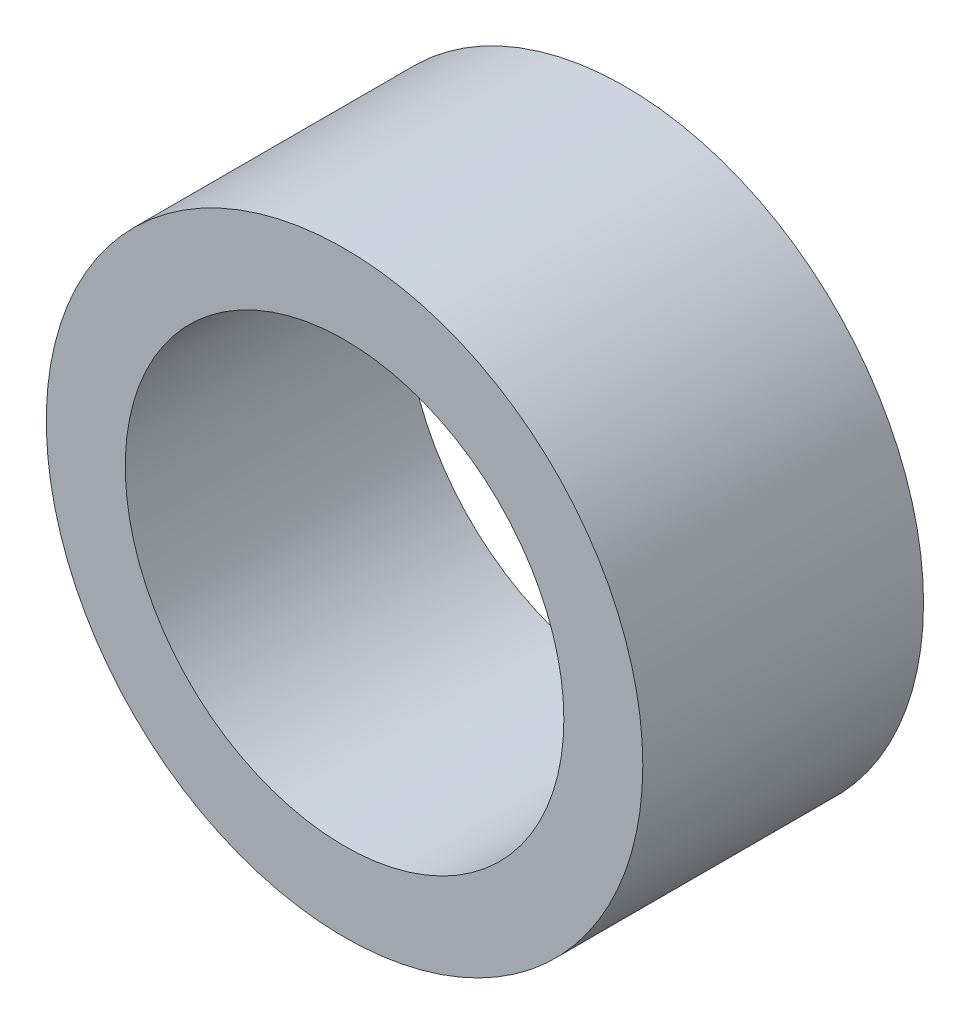
ISO-10303-21;
HEADER;
FILE_DESCRIPTION(('STEP AP214'),'2;1');
FILE_NAME('part.step','',(''),(''),'','','');
FILE_SCHEMA(('AUTOMOTIVE_DESIGN { 1 0 10303 214 1 1 1 1 }'));
ENDSEC;
DATA;
#1=APPLICATION_CONTEXT('core data for automotive mechanical design processes');
#2=APPLICATION_PROTOCOL_DEFINITION('international standard','automotive_design',2000,#1);
#3=PRODUCT_CONTEXT('',#1,'mechanical');
#4=PRODUCT('Part','Part','',(#3));
#5=PRODUCT_RELATED_PRODUCT_CATEGORY('part','',(#4));
#6=PRODUCT_DEFINITION_FORMATION('','',#4);
#7=PRODUCT_DEFINITION_CONTEXT('part definition',#1,'design');
#8=PRODUCT_DEFINITION('design','',#6,#7);
#9=PRODUCT_DEFINITION_SHAPE('','',#8);
#10=(LENGTH_UNIT() NAMED_UNIT(*) SI_UNIT(.MILLI.,.METRE.));
#11=(NAMED_UNIT(*) PLANE_ANGLE_UNIT() SI_UNIT($,.RADIAN.));
#12=(NAMED_UNIT(*) SI_UNIT($,.STERADIAN.) SOLID_ANGLE_UNIT());
#13=UNCERTAINTY_MEASURE_WITH_UNIT(LENGTH_MEASURE(1.E-05),#10,'distance_accuracy_value','');
#14=(GEOMETRIC_REPRESENTATION_CONTEXT(3) GLOBAL_UNCERTAINTY_ASSIGNED_CONTEXT((#13)) GLOBAL_UNIT_ASSIGNED_CONTEXT((#10,
#11,#12)) REPRESENTATION_CONTEXT('',''));
#15=CARTESIAN_POINT('',(0.,0.,0.));
#16=DIRECTION('',(0.,0.,1.));
#17=DIRECTION('',(1.,0.,0.));
#18=AXIS2_PLACEMENT_3D('',#15,#16,#17);
#19=CARTESIAN_POINT('',(0.,0.,71.5));
#20=DIRECTION('',(0.,0.,1.));
#21=DIRECTION('',(1.,0.,0.));
#22=AXIS2_PLACEMENT_3D('',#19,#20,#21);
#23=PLANE('',#22);
#24=CARTESIAN_POINT('',(0.,0.,71.5));
#25=DIRECTION('',(0.,0.,1.));
#26=DIRECTION('',(1.,0.,0.));
#27=AXIS2_PLACEMENT_3D('',#24,#25,#26);
#28=CIRCLE('',#27,17.);
#29=CARTESIAN_POINT('',(17.,0.,71.5));
#30=VERTEX_POINT('',#29);
#31=EDGE_CURVE('E10',#30,#30,#28,.T.);
#32=ORIENTED_EDGE('',*,*,#31,.T.);
#33=EDGE_LOOP('',(#32));
#34=FACE_BOUND('',#33,.T.);
#35=CARTESIAN_POINT('',(0.,0.,71.5));
#36=DIRECTION('',(0.,0.,1.));
#37=DIRECTION('',(1.,0.,0.));
#38=AXIS2_PLACEMENT_3D('',#35,#36,#37);
#39=CIRCLE('',#38,12.5);
#40=CARTESIAN_POINT('',(12.5,0.,71.5));
#41=VERTEX_POINT('',#40);
#42=EDGE_CURVE('E49',#41,#41,#39,.T.);
#43=ORIENTED_EDGE('',*,*,#42,.F.);
#44=EDGE_LOOP('',(#43));
#45=FACE_BOUND('',#44,.T.);
#46=ADVANCED_FACE('F36',(#34,#45),#23,.T.);
#47=CARTESIAN_POINT('',(0.,0.,55.5));
#48=DIRECTION('',(0.,0.,1.));
#49=DIRECTION('',(1.,0.,0.));
#50=AXIS2_PLACEMENT_3D('',#47,#48,#49);
#51=PLANE('',#50);
#52=CARTESIAN_POINT('',(0.,0.,55.5));
#53=DIRECTION('',(0.,0.,1.));
#54=DIRECTION('',(1.,0.,0.));
#55=AXIS2_PLACEMENT_3D('',#52,#53,#54);
#56=CIRCLE('',#55,17.);
#57=CARTESIAN_POINT('',(17.,0.,55.5));
#58=VERTEX_POINT('',#57);
#59=EDGE_CURVE('E40',#58,#58,#56,.T.);
#60=ORIENTED_EDGE('',*,*,#59,.F.);
#61=EDGE_LOOP('',(#60));
#62=FACE_BOUND('',#61,.T.);
#63=CARTESIAN_POINT('',(0.,0.,55.5));
#64=DIRECTION('',(0.,0.,1.));
#65=DIRECTION('',(1.,0.,0.));
#66=AXIS2_PLACEMENT_3D('',#63,#64,#65);
#67=CIRCLE('',#66,12.5);
#68=CARTESIAN_POINT('',(12.5,0.,55.5));
#69=VERTEX_POINT('',#68);
#70=EDGE_CURVE('E51',#69,#69,#67,.T.);
#71=ORIENTED_EDGE('',*,*,#70,.T.);
#72=EDGE_LOOP('',(#71));
#73=FACE_BOUND('',#72,.T.);
#74=ADVANCED_FACE('F63',(#62,#73),#51,.F.);
#75=CARTESIAN_POINT('',(0.,0.,71.5));
#76=DIRECTION('',(0.,0.,-1.));
#77=DIRECTION('',(-1.,0.,0.));
#78=AXIS2_PLACEMENT_3D('',#75,#76,#77);
#79=CYLINDRICAL_SURFACE('',#78,17.);
#80=ORIENTED_EDGE('',*,*,#31,.F.);
#81=EDGE_LOOP('',(#80));
#82=FACE_BOUND('',#81,.T.);
#83=ORIENTED_EDGE('',*,*,#59,.T.);
#84=EDGE_LOOP('',(#83));
#85=FACE_BOUND('',#84,.T.);
#86=ADVANCED_FACE('F38',(#82,#85),#79,.T.);
#87=CARTESIAN_POINT('',(0.,0.,71.5));
#88=DIRECTION('',(0.,0.,-1.));
#89=DIRECTION('',(-1.,0.,0.));
#90=AXIS2_PLACEMENT_3D('',#87,#88,#89);
#91=CYLINDRICAL_SURFACE('',#90,12.5);
#92=ORIENTED_EDGE('',*,*,#42,.T.);
#93=EDGE_LOOP('',(#92));
#94=FACE_BOUND('',#93,.T.);
#95=ORIENTED_EDGE('',*,*,#70,.F.);
#96=EDGE_LOOP('',(#95));
#97=FACE_BOUND('',#96,.T.);
#98=ADVANCED_FACE('F59',(#94,#97),#91,.F.);
#99=CLOSED_SHELL('',(#46,#74,#86,#98));
#100=MANIFOLD_SOLID_BREP('B2',#99);
#101=ADVANCED_BREP_SHAPE_REPRESENTATION('',(#18,#100),#14);
#102=SHAPE_DEFINITION_REPRESENTATION(#9,#101);
ENDSEC;
END-ISO-10303-21;
